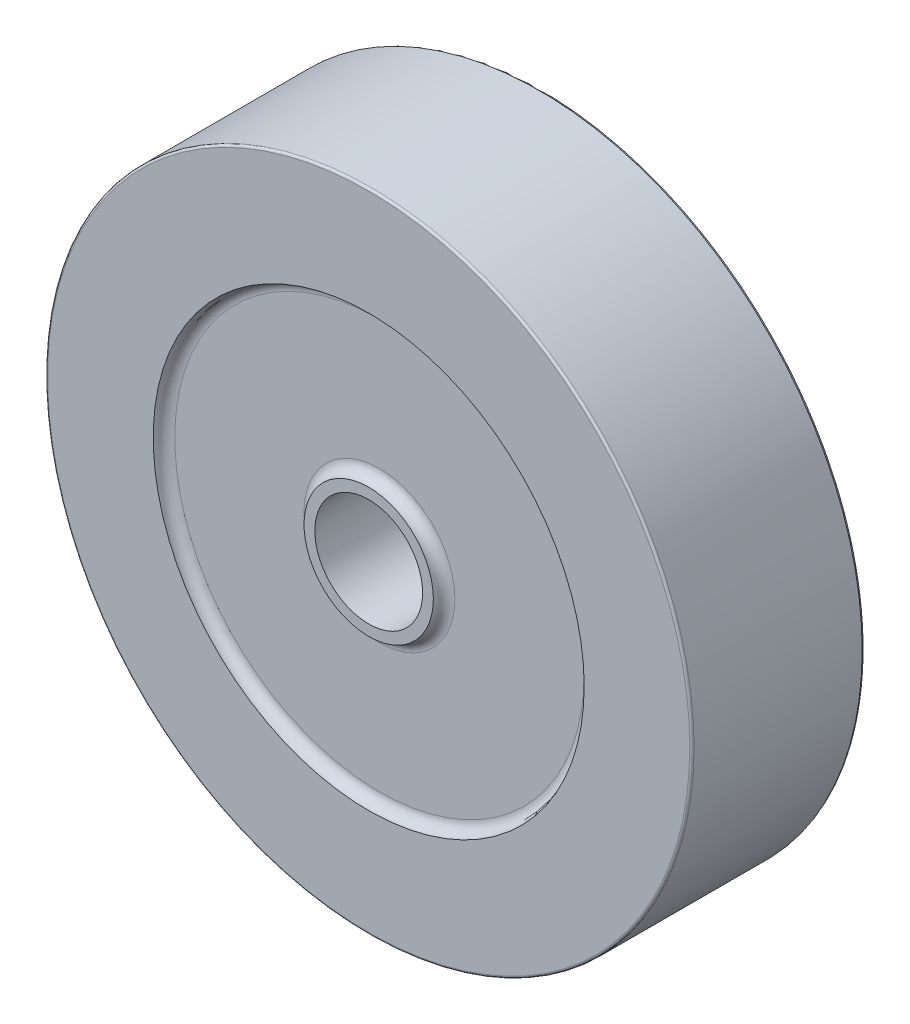
ISO-10303-21;
HEADER;
FILE_DESCRIPTION(('STEP AP214'),'2;1');
FILE_NAME('part.step','',(''),(''),'','','');
FILE_SCHEMA(('AUTOMOTIVE_DESIGN { 1 0 10303 214 1 1 1 1 }'));
ENDSEC;
DATA;
#1=APPLICATION_CONTEXT('core data for automotive mechanical design processes');
#2=APPLICATION_PROTOCOL_DEFINITION('international standard','automotive_design',2000,#1);
#3=PRODUCT_CONTEXT('',#1,'mechanical');
#4=PRODUCT('Part','Part','',(#3));
#5=PRODUCT_RELATED_PRODUCT_CATEGORY('part','',(#4));
#6=PRODUCT_DEFINITION_FORMATION('','',#4);
#7=PRODUCT_DEFINITION_CONTEXT('part definition',#1,'design');
#8=PRODUCT_DEFINITION('design','',#6,#7);
#9=PRODUCT_DEFINITION_SHAPE('','',#8);
#10=(LENGTH_UNIT() NAMED_UNIT(*) SI_UNIT(.MILLI.,.METRE.));
#11=(NAMED_UNIT(*) PLANE_ANGLE_UNIT() SI_UNIT($,.RADIAN.));
#12=(NAMED_UNIT(*) SI_UNIT($,.STERADIAN.) SOLID_ANGLE_UNIT());
#13=UNCERTAINTY_MEASURE_WITH_UNIT(LENGTH_MEASURE(1.E-05),#10,'distance_accuracy_value','');
#14=(GEOMETRIC_REPRESENTATION_CONTEXT(3) GLOBAL_UNCERTAINTY_ASSIGNED_CONTEXT((#13)) GLOBAL_UNIT_ASSIGNED_CONTEXT((#10,
#11,#12)) REPRESENTATION_CONTEXT('',''));
#15=CARTESIAN_POINT('',(0.,0.,0.));
#16=DIRECTION('',(0.,0.,1.));
#17=DIRECTION('',(1.,0.,0.));
#18=AXIS2_PLACEMENT_3D('',#15,#16,#17);
#19=CARTESIAN_POINT('',(0.,0.,0.));
#20=DIRECTION('',(0.,0.,1.));
#21=DIRECTION('',(1.,0.,0.));
#22=AXIS2_PLACEMENT_3D('',#19,#20,#21);
#23=PLANE('',#22);
#24=CARTESIAN_POINT('',(0.,0.,0.));
#25=DIRECTION('',(0.,0.,1.));
#26=DIRECTION('',(1.,0.,0.));
#27=AXIS2_PLACEMENT_3D('',#24,#25,#26);
#28=CIRCLE('',#27,6.35);
#29=CARTESIAN_POINT('',(6.35,0.,0.));
#30=VERTEX_POINT('',#29);
#31=EDGE_CURVE('E129',#30,#30,#28,.T.);
#32=ORIENTED_EDGE('',*,*,#31,.F.);
#33=EDGE_LOOP('',(#32));
#34=FACE_BOUND('',#33,.T.);
#35=CARTESIAN_POINT('',(0.,0.,0.));
#36=DIRECTION('',(0.,0.,1.));
#37=DIRECTION('',(1.,0.,0.));
#38=AXIS2_PLACEMENT_3D('',#35,#36,#37);
#39=CIRCLE('',#38,7.62);
#40=CARTESIAN_POINT('',(7.62,0.,0.));
#41=VERTEX_POINT('',#40);
#42=EDGE_CURVE('E146',#41,#41,#39,.T.);
#43=ORIENTED_EDGE('',*,*,#42,.T.);
#44=EDGE_LOOP('',(#43));
#45=FACE_BOUND('',#44,.T.);
#46=ADVANCED_FACE('F36',(#34,#45),#23,.T.);
#47=CARTESIAN_POINT('',(0.,-7.62,-1.27));
#48=DIRECTION('',(0.,0.,1.));
#49=DIRECTION('',(1.,0.,0.));
#50=AXIS2_PLACEMENT_3D('',#47,#48,#49);
#51=PLANE('',#50);
#52=CARTESIAN_POINT('',(0.,0.,-1.27));
#53=DIRECTION('',(0.,0.,1.));
#54=DIRECTION('',(1.,0.,0.));
#55=AXIS2_PLACEMENT_3D('',#52,#53,#54);
#56=CIRCLE('',#55,8.89);
#57=CARTESIAN_POINT('',(8.89,0.,-1.27));
#58=VERTEX_POINT('',#57);
#59=EDGE_CURVE('E158',#58,#58,#56,.F.);
#60=ORIENTED_EDGE('',*,*,#59,.T.);
#61=EDGE_LOOP('',(#60));
#62=FACE_BOUND('',#61,.T.);
#63=CARTESIAN_POINT('',(0.,0.,-1.27));
#64=DIRECTION('',(0.,0.,1.));
#65=DIRECTION('',(1.,0.,0.));
#66=AXIS2_PLACEMENT_3D('',#63,#64,#65);
#67=CIRCLE('',#66,24.13);
#68=CARTESIAN_POINT('',(24.13,0.,-1.27));
#69=VERTEX_POINT('',#68);
#70=EDGE_CURVE('E155',#69,#69,#67,.T.);
#71=ORIENTED_EDGE('',*,*,#70,.T.);
#72=EDGE_LOOP('',(#71));
#73=FACE_BOUND('',#72,.T.);
#74=ADVANCED_FACE('F186',(#62,#73),#51,.T.);
#75=CARTESIAN_POINT('',(0.,-25.4,0.));
#76=DIRECTION('',(0.,0.,1.));
#77=DIRECTION('',(1.,0.,0.));
#78=AXIS2_PLACEMENT_3D('',#75,#76,#77);
#79=PLANE('',#78);
#80=CARTESIAN_POINT('',(0.,0.,0.));
#81=DIRECTION('',(0.,0.,1.));
#82=DIRECTION('',(1.,0.,0.));
#83=AXIS2_PLACEMENT_3D('',#80,#81,#82);
#84=CIRCLE('',#83,37.846);
#85=CARTESIAN_POINT('',(37.846,0.,0.));
#86=VERTEX_POINT('',#85);
#87=EDGE_CURVE('E161',#86,#86,#84,.T.);
#88=ORIENTED_EDGE('',*,*,#87,.T.);
#89=EDGE_LOOP('',(#88));
#90=FACE_BOUND('',#89,.T.);
#91=CARTESIAN_POINT('',(0.,0.,0.));
#92=DIRECTION('',(0.,0.,1.));
#93=DIRECTION('',(1.,0.,0.));
#94=AXIS2_PLACEMENT_3D('',#91,#92,#93);
#95=CIRCLE('',#94,25.4);
#96=CARTESIAN_POINT('',(25.4,0.,0.));
#97=VERTEX_POINT('',#96);
#98=EDGE_CURVE('E143',#97,#97,#95,.T.);
#99=ORIENTED_EDGE('',*,*,#98,.F.);
#100=EDGE_LOOP('',(#99));
#101=FACE_BOUND('',#100,.T.);
#102=ADVANCED_FACE('F217',(#90,#101),#79,.T.);
#103=CARTESIAN_POINT('',(0.,0.,0.));
#104=DIRECTION('',(0.,0.,1.));
#105=DIRECTION('',(1.,0.,0.));
#106=AXIS2_PLACEMENT_3D('',#103,#104,#105);
#107=CYLINDRICAL_SURFACE('',#106,38.1);
#108=CARTESIAN_POINT('',(0.,0.,-0.254000000000004));
#109=DIRECTION('',(0.,0.,1.));
#110=DIRECTION('',(1.,0.,0.));
#111=AXIS2_PLACEMENT_3D('',#108,#109,#110);
#112=CIRCLE('',#111,38.1);
#113=CARTESIAN_POINT('',(38.1,0.,-0.254000000000004));
#114=VERTEX_POINT('',#113);
#115=EDGE_CURVE('E167',#114,#114,#112,.F.);
#116=ORIENTED_EDGE('',*,*,#115,.T.);
#117=EDGE_LOOP('',(#116));
#118=FACE_BOUND('',#117,.T.);
#119=CARTESIAN_POINT('',(0.,0.,-20.066));
#120=DIRECTION('',(0.,0.,-1.));
#121=DIRECTION('',(-1.,0.,0.));
#122=AXIS2_PLACEMENT_3D('',#119,#120,#121);
#123=CIRCLE('',#122,38.1);
#124=CARTESIAN_POINT('',(-38.1,0.,-20.066));
#125=VERTEX_POINT('',#124);
#126=EDGE_CURVE('E164',#125,#125,#123,.F.);
#127=ORIENTED_EDGE('',*,*,#126,.T.);
#128=EDGE_LOOP('',(#127));
#129=FACE_BOUND('',#128,.T.);
#130=ADVANCED_FACE('F220',(#118,#129),#107,.T.);
#131=CARTESIAN_POINT('',(0.,-25.4,-20.32));
#132=DIRECTION('',(0.,0.,-1.));
#133=DIRECTION('',(-1.,0.,0.));
#134=AXIS2_PLACEMENT_3D('',#131,#132,#133);
#135=PLANE('',#134);
#136=CARTESIAN_POINT('',(0.,0.,-20.32));
#137=DIRECTION('',(0.,0.,-1.));
#138=DIRECTION('',(-1.,0.,0.));
#139=AXIS2_PLACEMENT_3D('',#136,#137,#138);
#140=CIRCLE('',#139,37.846);
#141=CARTESIAN_POINT('',(-37.846,0.,-20.32));
#142=VERTEX_POINT('',#141);
#143=EDGE_CURVE('E169',#142,#142,#140,.T.);
#144=ORIENTED_EDGE('',*,*,#143,.T.);
#145=EDGE_LOOP('',(#144));
#146=FACE_BOUND('',#145,.T.);
#147=CARTESIAN_POINT('',(0.,0.,-20.32));
#148=DIRECTION('',(0.,0.,1.));
#149=DIRECTION('',(1.,0.,0.));
#150=AXIS2_PLACEMENT_3D('',#147,#148,#149);
#151=CIRCLE('',#150,25.4);
#152=CARTESIAN_POINT('',(25.4,0.,-20.32));
#153=VERTEX_POINT('',#152);
#154=EDGE_CURVE('E140',#153,#153,#151,.T.);
#155=ORIENTED_EDGE('',*,*,#154,.T.);
#156=EDGE_LOOP('',(#155));
#157=FACE_BOUND('',#156,.T.);
#158=ADVANCED_FACE('F243',(#146,#157),#135,.T.);
#159=CARTESIAN_POINT('',(0.,-11.4300000000001,-19.05));
#160=DIRECTION('',(0.,0.,-1.));
#161=DIRECTION('',(-1.,0.,0.));
#162=AXIS2_PLACEMENT_3D('',#159,#160,#161);
#163=PLANE('',#162);
#164=CARTESIAN_POINT('',(0.,0.,-19.05));
#165=DIRECTION('',(0.,0.,-1.));
#166=DIRECTION('',(-1.,0.,0.));
#167=AXIS2_PLACEMENT_3D('',#164,#165,#166);
#168=CIRCLE('',#167,12.7000000000001);
#169=CARTESIAN_POINT('',(-12.7000000000001,0.,-19.05));
#170=VERTEX_POINT('',#169);
#171=EDGE_CURVE('E152',#170,#170,#168,.F.);
#172=ORIENTED_EDGE('',*,*,#171,.T.);
#173=EDGE_LOOP('',(#172));
#174=FACE_BOUND('',#173,.T.);
#175=CARTESIAN_POINT('',(0.,0.,-19.05));
#176=DIRECTION('',(0.,0.,-1.));
#177=DIRECTION('',(-1.,0.,0.));
#178=AXIS2_PLACEMENT_3D('',#175,#176,#177);
#179=CIRCLE('',#178,24.13);
#180=CARTESIAN_POINT('',(-24.13,0.,-19.05));
#181=VERTEX_POINT('',#180);
#182=EDGE_CURVE('E149',#181,#181,#179,.T.);
#183=ORIENTED_EDGE('',*,*,#182,.T.);
#184=EDGE_LOOP('',(#183));
#185=FACE_BOUND('',#184,.T.);
#186=ADVANCED_FACE('F240',(#174,#185),#163,.T.);
#187=CARTESIAN_POINT('',(0.,0.,-20.32));
#188=DIRECTION('',(0.,0.,-1.));
#189=DIRECTION('',(-1.,0.,0.));
#190=AXIS2_PLACEMENT_3D('',#187,#188,#189);
#191=PLANE('',#190);
#192=DIRECTION('',(1.,0.,0.));
#193=VECTOR('',#192,1.);
#194=CARTESIAN_POINT('',(6.35,6.35,-20.32));
#195=LINE('',#194,#193);
#196=CARTESIAN_POINT('',(-6.35,6.35,-20.32));
#197=VERTEX_POINT('',#196);
#198=CARTESIAN_POINT('',(6.35,6.35,-20.32));
#199=VERTEX_POINT('',#198);
#200=EDGE_CURVE('E97',#197,#199,#195,.T.);
#201=ORIENTED_EDGE('',*,*,#200,.F.);
#202=DIRECTION('',(0.,1.,0.));
#203=VECTOR('',#202,1.);
#204=CARTESIAN_POINT('',(-6.35,-6.35,-20.32));
#205=LINE('',#204,#203);
#206=CARTESIAN_POINT('',(-6.35,-6.35,-20.32));
#207=VERTEX_POINT('',#206);
#208=EDGE_CURVE('E123',#207,#197,#205,.T.);
#209=ORIENTED_EDGE('',*,*,#208,.F.);
#210=DIRECTION('',(-1.,0.,0.));
#211=VECTOR('',#210,1.);
#212=CARTESIAN_POINT('',(6.35,-6.35,-20.32));
#213=LINE('',#212,#211);
#214=CARTESIAN_POINT('',(6.35,-6.35,-20.32));
#215=VERTEX_POINT('',#214);
#216=EDGE_CURVE('E121',#215,#207,#213,.T.);
#217=ORIENTED_EDGE('',*,*,#216,.F.);
#218=DIRECTION('',(0.,-1.,0.));
#219=VECTOR('',#218,1.);
#220=CARTESIAN_POINT('',(6.35,-6.35,-20.32));
#221=LINE('',#220,#219);
#222=EDGE_CURVE('E103',#199,#215,#221,.T.);
#223=ORIENTED_EDGE('',*,*,#222,.F.);
#224=EDGE_LOOP('',(#201,#209,#217,#223));
#225=FACE_BOUND('',#224,.T.);
#226=CARTESIAN_POINT('',(0.,0.,-20.32));
#227=DIRECTION('',(0.,0.,1.));
#228=DIRECTION('',(1.,0.,0.));
#229=AXIS2_PLACEMENT_3D('',#226,#227,#228);
#230=CIRCLE('',#229,11.4300000000001);
#231=CARTESIAN_POINT('',(11.4300000000001,0.,-20.32));
#232=VERTEX_POINT('',#231);
#233=EDGE_CURVE('E137',#232,#232,#230,.T.);
#234=ORIENTED_EDGE('',*,*,#233,.F.);
#235=EDGE_LOOP('',(#234));
#236=FACE_BOUND('',#235,.T.);
#237=ADVANCED_FACE('F180',(#225,#236),#191,.T.);
#238=CARTESIAN_POINT('',(0.,0.,-20.32));
#239=DIRECTION('',(0.,0.,1.));
#240=DIRECTION('',(1.,0.,0.));
#241=AXIS2_PLACEMENT_3D('',#238,#239,#240);
#242=CYLINDRICAL_SURFACE('',#241,6.35);
#243=CARTESIAN_POINT('',(0.,0.,-15.24));
#244=DIRECTION('',(0.,0.,1.));
#245=DIRECTION('',(1.,0.,0.));
#246=AXIS2_PLACEMENT_3D('',#243,#244,#245);
#247=CIRCLE('',#246,6.35);
#248=CARTESIAN_POINT('',(0.,6.35,-15.24));
#249=VERTEX_POINT('',#248);
#250=CARTESIAN_POINT('',(6.35,0.,-15.24));
#251=VERTEX_POINT('',#250);
#252=EDGE_CURVE('E40',#249,#251,#247,.F.);
#253=ORIENTED_EDGE('',*,*,#252,.T.);
#254=CARTESIAN_POINT('',(0.,-6.35,-15.24));
#255=VERTEX_POINT('',#254);
#256=EDGE_CURVE('E11',#251,#255,#247,.F.);
#257=ORIENTED_EDGE('',*,*,#256,.T.);
#258=CARTESIAN_POINT('',(-6.35,0.,-15.24));
#259=VERTEX_POINT('',#258);
#260=EDGE_CURVE('E45',#255,#259,#247,.F.);
#261=ORIENTED_EDGE('',*,*,#260,.T.);
#262=EDGE_CURVE('E173',#259,#249,#247,.F.);
#263=ORIENTED_EDGE('',*,*,#262,.T.);
#264=EDGE_LOOP('',(#253,#257,#261,#263));
#265=FACE_BOUND('',#264,.T.);
#266=ORIENTED_EDGE('',*,*,#31,.T.);
#267=EDGE_LOOP('',(#266));
#268=FACE_BOUND('',#267,.T.);
#269=ADVANCED_FACE('F176',(#265,#268),#242,.F.);
#270=CARTESIAN_POINT('',(0.,0.,-20.32));
#271=DIRECTION('',(0.,0.,-1.));
#272=DIRECTION('',(-1.,0.,0.));
#273=AXIS2_PLACEMENT_3D('',#270,#271,#272);
#274=TOROIDAL_SURFACE('',#273,12.7000000000001,1.27);
#275=ORIENTED_EDGE('',*,*,#233,.T.);
#276=EDGE_LOOP('',(#275));
#277=FACE_BOUND('',#276,.T.);
#278=ORIENTED_EDGE('',*,*,#171,.F.);
#279=EDGE_LOOP('',(#278));
#280=FACE_BOUND('',#279,.T.);
#281=ADVANCED_FACE('F179',(#277,#280),#274,.F.);
#282=CARTESIAN_POINT('',(0.,0.,-20.32));
#283=DIRECTION('',(0.,0.,-1.));
#284=DIRECTION('',(-1.,0.,0.));
#285=AXIS2_PLACEMENT_3D('',#282,#283,#284);
#286=TOROIDAL_SURFACE('',#285,24.13,1.27);
#287=ORIENTED_EDGE('',*,*,#182,.F.);
#288=EDGE_LOOP('',(#287));
#289=FACE_BOUND('',#288,.T.);
#290=ORIENTED_EDGE('',*,*,#154,.F.);
#291=EDGE_LOOP('',(#290));
#292=FACE_BOUND('',#291,.T.);
#293=ADVANCED_FACE('F193',(#289,#292),#286,.F.);
#294=CARTESIAN_POINT('',(0.,0.,0.));
#295=DIRECTION('',(0.,0.,1.));
#296=DIRECTION('',(1.,0.,0.));
#297=AXIS2_PLACEMENT_3D('',#294,#295,#296);
#298=TOROIDAL_SURFACE('',#297,8.89,1.27);
#299=ORIENTED_EDGE('',*,*,#59,.F.);
#300=EDGE_LOOP('',(#299));
#301=FACE_BOUND('',#300,.T.);
#302=ORIENTED_EDGE('',*,*,#42,.F.);
#303=EDGE_LOOP('',(#302));
#304=FACE_BOUND('',#303,.T.);
#305=ADVANCED_FACE('F190',(#301,#304),#298,.F.);
#306=CARTESIAN_POINT('',(0.,0.,0.));
#307=DIRECTION('',(0.,0.,1.));
#308=DIRECTION('',(1.,0.,0.));
#309=AXIS2_PLACEMENT_3D('',#306,#307,#308);
#310=TOROIDAL_SURFACE('',#309,24.13,1.27);
#311=ORIENTED_EDGE('',*,*,#98,.T.);
#312=EDGE_LOOP('',(#311));
#313=FACE_BOUND('',#312,.T.);
#314=ORIENTED_EDGE('',*,*,#70,.F.);
#315=EDGE_LOOP('',(#314));
#316=FACE_BOUND('',#315,.T.);
#317=ADVANCED_FACE('F192',(#313,#316),#310,.F.);
#318=CARTESIAN_POINT('',(0.,0.,-0.254000000000004));
#319=DIRECTION('',(0.,0.,1.));
#320=DIRECTION('',(1.,0.,0.));
#321=AXIS2_PLACEMENT_3D('',#318,#319,#320);
#322=TOROIDAL_SURFACE('',#321,37.846,0.254);
#323=ORIENTED_EDGE('',*,*,#115,.F.);
#324=EDGE_LOOP('',(#323));
#325=FACE_BOUND('',#324,.T.);
#326=ORIENTED_EDGE('',*,*,#87,.F.);
#327=EDGE_LOOP('',(#326));
#328=FACE_BOUND('',#327,.T.);
#329=ADVANCED_FACE('F200',(#325,#328),#322,.T.);
#330=CARTESIAN_POINT('',(0.,0.,-20.066));
#331=DIRECTION('',(0.,0.,-1.));
#332=DIRECTION('',(-1.,0.,0.));
#333=AXIS2_PLACEMENT_3D('',#330,#331,#332);
#334=TOROIDAL_SURFACE('',#333,37.846,0.254);
#335=ORIENTED_EDGE('',*,*,#143,.F.);
#336=EDGE_LOOP('',(#335));
#337=FACE_BOUND('',#336,.T.);
#338=ORIENTED_EDGE('',*,*,#126,.F.);
#339=EDGE_LOOP('',(#338));
#340=FACE_BOUND('',#339,.T.);
#341=ADVANCED_FACE('F38',(#337,#340),#334,.T.);
#342=CARTESIAN_POINT('',(6.35,-6.35,-15.24));
#343=DIRECTION('',(1.,0.,0.));
#344=DIRECTION('',(0.,0.,-1.));
#345=AXIS2_PLACEMENT_3D('',#342,#343,#344);
#346=PLANE('',#345);
#347=DIRECTION('',(0.,-1.,0.));
#348=VECTOR('',#347,1.);
#349=CARTESIAN_POINT('',(6.35,-6.35,-15.24));
#350=LINE('',#349,#348);
#351=CARTESIAN_POINT('',(6.35,6.35,-15.24));
#352=VERTEX_POINT('',#351);
#353=EDGE_CURVE('E52',#352,#251,#350,.T.);
#354=ORIENTED_EDGE('',*,*,#353,.F.);
#355=DIRECTION('',(0.,0.,-1.));
#356=VECTOR('',#355,1.);
#357=CARTESIAN_POINT('',(6.35,6.35,-15.24));
#358=LINE('',#357,#356);
#359=EDGE_CURVE('E127',#352,#199,#358,.T.);
#360=ORIENTED_EDGE('',*,*,#359,.T.);
#361=ORIENTED_EDGE('',*,*,#222,.T.);
#362=DIRECTION('',(0.,0.,-1.));
#363=VECTOR('',#362,1.);
#364=CARTESIAN_POINT('',(6.35,-6.35,-15.24));
#365=LINE('',#364,#363);
#366=CARTESIAN_POINT('',(6.35,-6.35,-15.24));
#367=VERTEX_POINT('',#366);
#368=EDGE_CURVE('E100',#367,#215,#365,.T.);
#369=ORIENTED_EDGE('',*,*,#368,.F.);
#370=EDGE_CURVE('E90',#251,#367,#350,.T.);
#371=ORIENTED_EDGE('',*,*,#370,.F.);
#372=EDGE_LOOP('',(#354,#360,#361,#369,#371));
#373=FACE_BOUND('',#372,.T.);
#374=ADVANCED_FACE('F101',(#373),#346,.F.);
#375=CARTESIAN_POINT('',(6.35,6.35,-15.24));
#376=DIRECTION('',(0.,1.,0.));
#377=DIRECTION('',(0.,0.,1.));
#378=AXIS2_PLACEMENT_3D('',#375,#376,#377);
#379=PLANE('',#378);
#380=DIRECTION('',(1.,0.,0.));
#381=VECTOR('',#380,1.);
#382=CARTESIAN_POINT('',(6.35,6.35,-15.24));
#383=LINE('',#382,#381);
#384=CARTESIAN_POINT('',(-6.35,6.35,-15.24));
#385=VERTEX_POINT('',#384);
#386=EDGE_CURVE('E107',#385,#249,#383,.T.);
#387=ORIENTED_EDGE('',*,*,#386,.F.);
#388=DIRECTION('',(0.,0.,-1.));
#389=VECTOR('',#388,1.);
#390=CARTESIAN_POINT('',(-6.35,6.35,-15.24));
#391=LINE('',#390,#389);
#392=EDGE_CURVE('E130',#385,#197,#391,.T.);
#393=ORIENTED_EDGE('',*,*,#392,.T.);
#394=ORIENTED_EDGE('',*,*,#200,.T.);
#395=ORIENTED_EDGE('',*,*,#359,.F.);
#396=EDGE_CURVE('E117',#249,#352,#383,.T.);
#397=ORIENTED_EDGE('',*,*,#396,.F.);
#398=EDGE_LOOP('',(#387,#393,#394,#395,#397));
#399=FACE_BOUND('',#398,.T.);
#400=ADVANCED_FACE('F261',(#399),#379,.F.);
#401=CARTESIAN_POINT('',(-6.35,-6.35,-15.24));
#402=DIRECTION('',(-1.,0.,0.));
#403=DIRECTION('',(0.,0.,1.));
#404=AXIS2_PLACEMENT_3D('',#401,#402,#403);
#405=PLANE('',#404);
#406=DIRECTION('',(0.,1.,0.));
#407=VECTOR('',#406,1.);
#408=CARTESIAN_POINT('',(-6.35,-6.35,-15.24));
#409=LINE('',#408,#407);
#410=CARTESIAN_POINT('',(-6.35,-6.35,-15.24));
#411=VERTEX_POINT('',#410);
#412=EDGE_CURVE('E114',#411,#259,#409,.T.);
#413=ORIENTED_EDGE('',*,*,#412,.F.);
#414=DIRECTION('',(0.,0.,-1.));
#415=VECTOR('',#414,1.);
#416=CARTESIAN_POINT('',(-6.35,-6.35,-15.24));
#417=LINE('',#416,#415);
#418=EDGE_CURVE('E106',#411,#207,#417,.T.);
#419=ORIENTED_EDGE('',*,*,#418,.T.);
#420=ORIENTED_EDGE('',*,*,#208,.T.);
#421=ORIENTED_EDGE('',*,*,#392,.F.);
#422=EDGE_CURVE('E112',#259,#385,#409,.T.);
#423=ORIENTED_EDGE('',*,*,#422,.F.);
#424=EDGE_LOOP('',(#413,#419,#420,#421,#423));
#425=FACE_BOUND('',#424,.T.);
#426=ADVANCED_FACE('F264',(#425),#405,.F.);
#427=CARTESIAN_POINT('',(6.35,-6.35,-15.24));
#428=DIRECTION('',(0.,-1.,0.));
#429=DIRECTION('',(0.,0.,-1.));
#430=AXIS2_PLACEMENT_3D('',#427,#428,#429);
#431=PLANE('',#430);
#432=DIRECTION('',(-1.,0.,0.));
#433=VECTOR('',#432,1.);
#434=CARTESIAN_POINT('',(6.35,-6.35,-15.24));
#435=LINE('',#434,#433);
#436=EDGE_CURVE('E94',#367,#255,#435,.T.);
#437=ORIENTED_EDGE('',*,*,#436,.F.);
#438=ORIENTED_EDGE('',*,*,#368,.T.);
#439=ORIENTED_EDGE('',*,*,#216,.T.);
#440=ORIENTED_EDGE('',*,*,#418,.F.);
#441=EDGE_CURVE('E111',#255,#411,#435,.T.);
#442=ORIENTED_EDGE('',*,*,#441,.F.);
#443=EDGE_LOOP('',(#437,#438,#439,#440,#442));
#444=FACE_BOUND('',#443,.T.);
#445=ADVANCED_FACE('F109',(#444),#431,.F.);
#446=CARTESIAN_POINT('',(0.,0.,-15.24));
#447=DIRECTION('',(0.,0.,1.));
#448=DIRECTION('',(1.,0.,0.));
#449=AXIS2_PLACEMENT_3D('',#446,#447,#448);
#450=PLANE('',#449);
#451=ORIENTED_EDGE('',*,*,#370,.T.);
#452=ORIENTED_EDGE('',*,*,#436,.T.);
#453=ORIENTED_EDGE('',*,*,#256,.F.);
#454=EDGE_LOOP('',(#451,#452,#453));
#455=FACE_BOUND('',#454,.T.);
#456=ADVANCED_FACE('F92',(#455),#450,.F.);
#457=ORIENTED_EDGE('',*,*,#441,.T.);
#458=ORIENTED_EDGE('',*,*,#412,.T.);
#459=ORIENTED_EDGE('',*,*,#260,.F.);
#460=EDGE_LOOP('',(#457,#458,#459));
#461=FACE_BOUND('',#460,.T.);
#462=ADVANCED_FACE('F272',(#461),#450,.F.);
#463=ORIENTED_EDGE('',*,*,#422,.T.);
#464=ORIENTED_EDGE('',*,*,#386,.T.);
#465=ORIENTED_EDGE('',*,*,#262,.F.);
#466=EDGE_LOOP('',(#463,#464,#465));
#467=FACE_BOUND('',#466,.T.);
#468=ADVANCED_FACE('F277',(#467),#450,.F.);
#469=ORIENTED_EDGE('',*,*,#396,.T.);
#470=ORIENTED_EDGE('',*,*,#353,.T.);
#471=ORIENTED_EDGE('',*,*,#252,.F.);
#472=EDGE_LOOP('',(#469,#470,#471));
#473=FACE_BOUND('',#472,.T.);
#474=ADVANCED_FACE('F273',(#473),#450,.F.);
#475=CLOSED_SHELL('',(#46,#74,#102,#130,#158,#186,#237,#269,#281,#293,#305,#317,#329,#341,#374,
#400,#426,#445,#456,#462,#468,#474));
#476=MANIFOLD_SOLID_BREP('B2',#475);
#477=ADVANCED_BREP_SHAPE_REPRESENTATION('',(#18,#476),#14);
#478=SHAPE_DEFINITION_REPRESENTATION(#9,#477);
ENDSEC;
END-ISO-10303-21;
